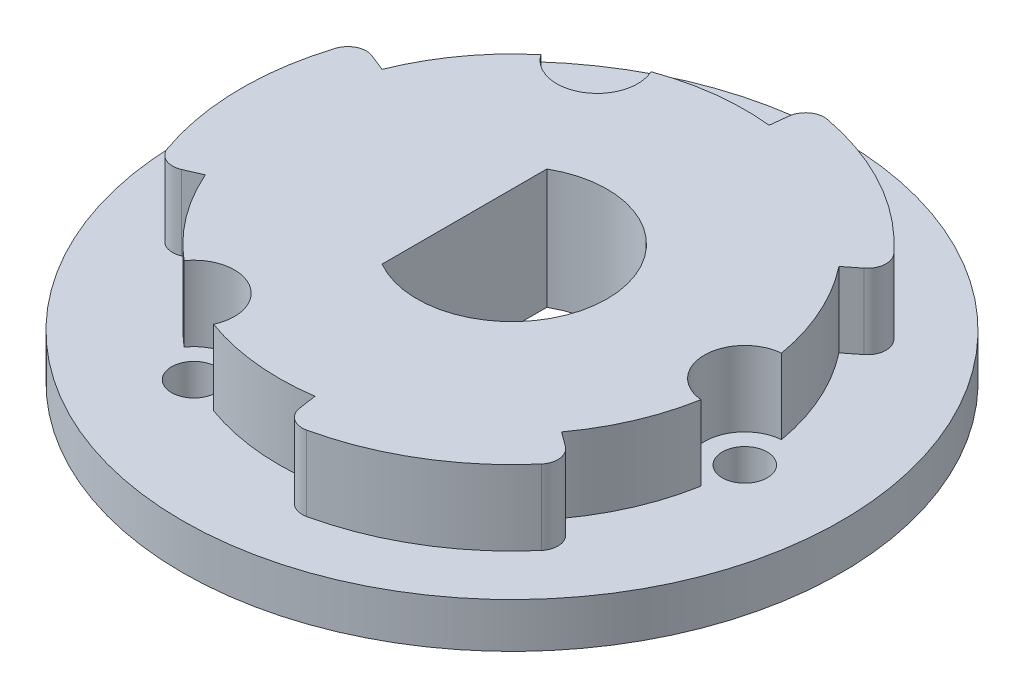
ISO-10303-21;
HEADER;
FILE_DESCRIPTION(('STEP AP214'),'2;1');
FILE_NAME('part.step','',(''),(''),'','','');
FILE_SCHEMA(('AUTOMOTIVE_DESIGN { 1 0 10303 214 1 1 1 1 }'));
ENDSEC;
DATA;
#1=APPLICATION_CONTEXT('core data for automotive mechanical design processes');
#2=APPLICATION_PROTOCOL_DEFINITION('international standard','automotive_design',2000,#1);
#3=PRODUCT_CONTEXT('',#1,'mechanical');
#4=PRODUCT('Part','Part','',(#3));
#5=PRODUCT_RELATED_PRODUCT_CATEGORY('part','',(#4));
#6=PRODUCT_DEFINITION_FORMATION('','',#4);
#7=PRODUCT_DEFINITION_CONTEXT('part definition',#1,'design');
#8=PRODUCT_DEFINITION('design','',#6,#7);
#9=PRODUCT_DEFINITION_SHAPE('','',#8);
#10=(LENGTH_UNIT() NAMED_UNIT(*) SI_UNIT(.MILLI.,.METRE.));
#11=(NAMED_UNIT(*) PLANE_ANGLE_UNIT() SI_UNIT($,.RADIAN.));
#12=(NAMED_UNIT(*) SI_UNIT($,.STERADIAN.) SOLID_ANGLE_UNIT());
#13=UNCERTAINTY_MEASURE_WITH_UNIT(LENGTH_MEASURE(1.E-05),#10,'distance_accuracy_value','');
#14=(GEOMETRIC_REPRESENTATION_CONTEXT(3) GLOBAL_UNCERTAINTY_ASSIGNED_CONTEXT((#13)) GLOBAL_UNIT_ASSIGNED_CONTEXT((#10,
#11,#12)) REPRESENTATION_CONTEXT('',''));
#15=CARTESIAN_POINT('',(0.,0.,0.));
#16=DIRECTION('',(0.,0.,1.));
#17=DIRECTION('',(1.,0.,0.));
#18=AXIS2_PLACEMENT_3D('',#15,#16,#17);
#19=CARTESIAN_POINT('',(0.,-25.,4.97865637605344E-13));
#20=DIRECTION('',(0.,1.,0.));
#21=DIRECTION('',(0.,0.,1.));
#22=AXIS2_PLACEMENT_3D('',#19,#20,#21);
#23=CYLINDRICAL_SURFACE('',#22,15.5400000000005);
#24=CARTESIAN_POINT('',(0.,-20.,4.97865637605344E-13));
#25=DIRECTION('',(0.,-1.,0.));
#26=DIRECTION('',(0.,0.,1.));
#27=AXIS2_PLACEMENT_3D('',#24,#25,#26);
#28=CIRCLE('',#27,15.5400000000005);
#29=CARTESIAN_POINT('',(-5.32329340448422,-20.,-14.5997995647123));
#30=VERTEX_POINT('',#29);
#31=CARTESIAN_POINT('',(1.71604446441181,-20.,-15.44496006457));
#32=VERTEX_POINT('',#31);
#33=EDGE_CURVE('E469',#30,#32,#28,.T.);
#34=ORIENTED_EDGE('',*,*,#33,.T.);
#35=DIRECTION('',(0.,1.,0.));
#36=VECTOR('',#35,1.);
#37=CARTESIAN_POINT('',(1.71604446441181,-25.,-15.44496006457));
#38=LINE('',#37,#36);
#39=CARTESIAN_POINT('',(1.71604446441181,-25.,-15.44496006457));
#40=VERTEX_POINT('',#39);
#41=EDGE_CURVE('E12',#40,#32,#38,.T.);
#42=ORIENTED_EDGE('',*,*,#41,.F.);
#43=CARTESIAN_POINT('',(0.,-25.,4.97865637605344E-13));
#44=DIRECTION('',(0.,-1.,0.));
#45=DIRECTION('',(0.,0.,1.));
#46=AXIS2_PLACEMENT_3D('',#43,#44,#45);
#47=CIRCLE('',#46,15.5400000000005);
#48=CARTESIAN_POINT('',(-5.32329340448422,-25.,-14.5997995647123));
#49=VERTEX_POINT('',#48);
#50=EDGE_CURVE('E473',#49,#40,#47,.T.);
#51=ORIENTED_EDGE('',*,*,#50,.F.);
#52=DIRECTION('',(0.,1.,0.));
#53=VECTOR('',#52,1.);
#54=CARTESIAN_POINT('',(-5.32329340448422,-25.,-14.5997995647123));
#55=LINE('',#54,#53);
#56=EDGE_CURVE('E570',#49,#30,#55,.T.);
#57=ORIENTED_EDGE('',*,*,#56,.T.);
#58=EDGE_LOOP('',(#34,#42,#51,#57));
#59=FACE_BOUND('',#58,.T.);
#60=ADVANCED_FACE('F244',(#59),#23,.T.);
#61=CARTESIAN_POINT('',(1.71604446441181,-25.,-15.44496006457));
#62=DIRECTION('',(0.993884174039252,0.,0.110427571712472));
#63=DIRECTION('',(0.110427571712472,0.,-0.993884174039253));
#64=AXIS2_PLACEMENT_3D('',#61,#62,#63);
#65=PLANE('',#64);
#66=DIRECTION('',(0.110427571712472,0.,-0.993884174039252));
#67=VECTOR('',#66,1.);
#68=CARTESIAN_POINT('',(1.71604446441181,-20.,-15.44496006457));
#69=LINE('',#68,#67);
#70=CARTESIAN_POINT('',(1.84893352009403,-20.,-16.6410049227285));
#71=VERTEX_POINT('',#70);
#72=EDGE_CURVE('E574',#32,#71,#69,.T.);
#73=ORIENTED_EDGE('',*,*,#72,.T.);
#74=DIRECTION('',(0.,1.,0.));
#75=VECTOR('',#74,1.);
#76=CARTESIAN_POINT('',(1.84893352009403,-25.,-16.6410049227285));
#77=LINE('',#76,#75);
#78=CARTESIAN_POINT('',(1.84893352009403,-25.,-16.6410049227285));
#79=VERTEX_POINT('',#78);
#80=EDGE_CURVE('E252',#79,#71,#77,.T.);
#81=ORIENTED_EDGE('',*,*,#80,.F.);
#82=DIRECTION('',(0.110427571712472,0.,-0.993884174039252));
#83=VECTOR('',#82,1.);
#84=CARTESIAN_POINT('',(1.71604446441181,-25.,-15.44496006457));
#85=LINE('',#84,#83);
#86=EDGE_CURVE('E477',#40,#79,#85,.T.);
#87=ORIENTED_EDGE('',*,*,#86,.F.);
#88=ORIENTED_EDGE('',*,*,#41,.T.);
#89=EDGE_LOOP('',(#73,#81,#87,#88));
#90=FACE_BOUND('',#89,.T.);
#91=ADVANCED_FACE('F751',(#90),#65,.F.);
#92=CARTESIAN_POINT('',(3.09128873764314,-25.,-16.5029704580879));
#93=DIRECTION('',(0.,1.,0.));
#94=DIRECTION('',(0.,0.,1.));
#95=AXIS2_PLACEMENT_3D('',#92,#93,#94);
#96=CYLINDRICAL_SURFACE('',#95,1.25000000000005);
#97=CARTESIAN_POINT('',(3.09128873764314,-20.,-16.5029704580879));
#98=DIRECTION('',(0.,-1.,0.));
#99=DIRECTION('',(0.,0.,-1.));
#100=AXIS2_PLACEMENT_3D('',#97,#98,#99);
#101=CIRCLE('',#100,1.25000000000005);
#102=CARTESIAN_POINT('',(3.32143233038018,-20.,-17.7316013736692));
#103=VERTEX_POINT('',#102);
#104=EDGE_CURVE('E577',#71,#103,#101,.T.);
#105=ORIENTED_EDGE('',*,*,#104,.T.);
#106=DIRECTION('',(0.,1.,0.));
#107=VECTOR('',#106,1.);
#108=CARTESIAN_POINT('',(3.32143233038018,-25.,-17.7316013736692));
#109=LINE('',#108,#107);
#110=CARTESIAN_POINT('',(3.32143233038018,-25.,-17.7316013736692));
#111=VERTEX_POINT('',#110);
#112=EDGE_CURVE('E725',#111,#103,#109,.T.);
#113=ORIENTED_EDGE('',*,*,#112,.F.);
#114=CARTESIAN_POINT('',(3.09128873764314,-25.,-16.5029704580879));
#115=DIRECTION('',(0.,-1.,0.));
#116=DIRECTION('',(0.,0.,-1.));
#117=AXIS2_PLACEMENT_3D('',#114,#115,#116);
#118=CIRCLE('',#117,1.25000000000005);
#119=EDGE_CURVE('E482',#79,#111,#118,.T.);
#120=ORIENTED_EDGE('',*,*,#119,.F.);
#121=ORIENTED_EDGE('',*,*,#80,.T.);
#122=EDGE_LOOP('',(#105,#113,#120,#121));
#123=FACE_BOUND('',#122,.T.);
#124=ADVANCED_FACE('F733',(#123),#96,.T.);
#125=CARTESIAN_POINT('',(0.,-25.,0.));
#126=DIRECTION('',(0.,1.,0.));
#127=DIRECTION('',(0.,0.,1.));
#128=AXIS2_PLACEMENT_3D('',#125,#126,#127);
#129=CYLINDRICAL_SURFACE('',#128,18.0400000000001);
#130=CARTESIAN_POINT('',(0.,-20.,0.));
#131=DIRECTION('',(0.,-1.,0.));
#132=DIRECTION('',(0.,0.,1.));
#133=AXIS2_PLACEMENT_3D('',#130,#131,#132);
#134=CIRCLE('',#133,18.0400000000001);
#135=CARTESIAN_POINT('',(13.2993209736678,-20.,-12.188915523514));
#136=VERTEX_POINT('',#135);
#137=EDGE_CURVE('E580',#103,#136,#134,.T.);
#138=ORIENTED_EDGE('',*,*,#137,.T.);
#139=DIRECTION('',(0.,1.,0.));
#140=VECTOR('',#139,1.);
#141=CARTESIAN_POINT('',(13.2993209736678,-25.,-12.188915523514));
#142=LINE('',#141,#140);
#143=CARTESIAN_POINT('',(13.2993209736678,-25.,-12.188915523514));
#144=VERTEX_POINT('',#143);
#145=EDGE_CURVE('E721',#144,#136,#142,.T.);
#146=ORIENTED_EDGE('',*,*,#145,.F.);
#147=CARTESIAN_POINT('',(0.,-25.,0.));
#148=DIRECTION('',(0.,-1.,0.));
#149=DIRECTION('',(0.,0.,1.));
#150=AXIS2_PLACEMENT_3D('',#147,#148,#149);
#151=CIRCLE('',#150,18.0400000000001);
#152=EDGE_CURVE('E486',#111,#144,#151,.T.);
#153=ORIENTED_EDGE('',*,*,#152,.F.);
#154=ORIENTED_EDGE('',*,*,#112,.T.);
#155=EDGE_LOOP('',(#138,#146,#153,#154));
#156=FACE_BOUND('',#155,.T.);
#157=ADVANCED_FACE('F742',(#156),#129,.T.);
#158=CARTESIAN_POINT('',(12.3778053187476,-25.,-11.344339851832));
#159=DIRECTION('',(0.,1.,0.));
#160=DIRECTION('',(0.,0.,1.));
#161=AXIS2_PLACEMENT_3D('',#158,#159,#160);
#162=CYLINDRICAL_SURFACE('',#161,1.24999966698402);
#163=CARTESIAN_POINT('',(12.3778053187476,-20.,-11.344339851832));
#164=DIRECTION('',(0.,-1.,0.));
#165=DIRECTION('',(0.,0.,1.));
#166=AXIS2_PLACEMENT_3D('',#163,#164,#165);
#167=CIRCLE('',#166,1.24999966698402);
#168=CARTESIAN_POINT('',(13.1514305846403,-20.,-10.3625032486069));
#169=VERTEX_POINT('',#168);
#170=EDGE_CURVE('E583',#136,#169,#167,.T.);
#171=ORIENTED_EDGE('',*,*,#170,.T.);
#172=DIRECTION('',(0.,1.,0.));
#173=VECTOR('',#172,1.);
#174=CARTESIAN_POINT('',(13.1514305846403,-25.,-10.3625032486069));
#175=LINE('',#174,#173);
#176=CARTESIAN_POINT('',(13.1514305846403,-25.,-10.3625032486069));
#177=VERTEX_POINT('',#176);
#178=EDGE_CURVE('E717',#177,#169,#175,.T.);
#179=ORIENTED_EDGE('',*,*,#178,.F.);
#180=CARTESIAN_POINT('',(12.3778053187476,-25.,-11.344339851832));
#181=DIRECTION('',(0.,-1.,0.));
#182=DIRECTION('',(0.,0.,1.));
#183=AXIS2_PLACEMENT_3D('',#180,#181,#182);
#184=CIRCLE('',#183,1.24999966698402);
#185=EDGE_CURVE('E490',#144,#177,#184,.T.);
#186=ORIENTED_EDGE('',*,*,#185,.F.);
#187=ORIENTED_EDGE('',*,*,#145,.T.);
#188=EDGE_LOOP('',(#171,#179,#186,#187));
#189=FACE_BOUND('',#188,.T.);
#190=ADVANCED_FACE('F746',(#189),#162,.T.);
#191=CARTESIAN_POINT('',(12.206193142477,-25.,-9.61771537157075));
#192=DIRECTION('',(-0.618900603061181,0.,-0.785469314187707));
#193=DIRECTION('',(-0.785469314187707,0.,0.618900603061181));
#194=AXIS2_PLACEMENT_3D('',#191,#192,#193);
#195=PLANE('',#194);
#196=DIRECTION('',(-0.785469314187707,0.,0.618900603061181));
#197=VECTOR('',#196,1.);
#198=CARTESIAN_POINT('',(12.206193142477,-20.,-9.61771537157075));
#199=LINE('',#198,#197);
#200=CARTESIAN_POINT('',(12.206193142477,-20.,-9.61771537157075));
#201=VERTEX_POINT('',#200);
#202=EDGE_CURVE('E586',#169,#201,#199,.T.);
#203=ORIENTED_EDGE('',*,*,#202,.T.);
#204=DIRECTION('',(0.,1.,0.));
#205=VECTOR('',#204,1.);
#206=CARTESIAN_POINT('',(12.206193142477,-25.,-9.61771537157075));
#207=LINE('',#206,#205);
#208=CARTESIAN_POINT('',(12.206193142477,-25.,-9.61771537157075));
#209=VERTEX_POINT('',#208);
#210=EDGE_CURVE('E713',#209,#201,#207,.T.);
#211=ORIENTED_EDGE('',*,*,#210,.F.);
#212=DIRECTION('',(-0.785469314187707,0.,0.618900603061181));
#213=VECTOR('',#212,1.);
#214=CARTESIAN_POINT('',(12.206193142477,-25.,-9.61771537157075));
#215=LINE('',#214,#213);
#216=EDGE_CURVE('E494',#177,#209,#215,.T.);
#217=ORIENTED_EDGE('',*,*,#216,.F.);
#218=ORIENTED_EDGE('',*,*,#178,.T.);
#219=EDGE_LOOP('',(#203,#211,#217,#218));
#220=FACE_BOUND('',#219,.T.);
#221=ADVANCED_FACE('F827',(#220),#195,.F.);
#222=CARTESIAN_POINT('',(0.,-25.,0.));
#223=DIRECTION('',(0.,1.,0.));
#224=DIRECTION('',(0.,0.,1.));
#225=AXIS2_PLACEMENT_3D('',#222,#223,#224);
#226=CYLINDRICAL_SURFACE('',#225,15.5399999999999);
#227=CARTESIAN_POINT('',(0.,-20.,0.));
#228=DIRECTION('',(0.,-1.,0.));
#229=DIRECTION('',(0.,0.,1.));
#230=AXIS2_PLACEMENT_3D('',#227,#228,#229);
#231=CIRCLE('',#230,15.5399999999999);
#232=CARTESIAN_POINT('',(15.305444015444,-20.,-2.68979246227454));
#233=VERTEX_POINT('',#232);
#234=EDGE_CURVE('E589',#201,#233,#231,.T.);
#235=ORIENTED_EDGE('',*,*,#234,.T.);
#236=DIRECTION('',(0.,1.,0.));
#237=VECTOR('',#236,1.);
#238=CARTESIAN_POINT('',(15.305444015444,-25.,-2.68979246227454));
#239=LINE('',#238,#237);
#240=CARTESIAN_POINT('',(15.305444015444,-25.,-2.68979246227454));
#241=VERTEX_POINT('',#240);
#242=EDGE_CURVE('E709',#241,#233,#239,.T.);
#243=ORIENTED_EDGE('',*,*,#242,.F.);
#244=CARTESIAN_POINT('',(0.,-25.,0.));
#245=DIRECTION('',(0.,-1.,0.));
#246=DIRECTION('',(0.,0.,1.));
#247=AXIS2_PLACEMENT_3D('',#244,#245,#246);
#248=CIRCLE('',#247,15.5399999999999);
#249=EDGE_CURVE('E498',#209,#241,#248,.T.);
#250=ORIENTED_EDGE('',*,*,#249,.F.);
#251=ORIENTED_EDGE('',*,*,#210,.T.);
#252=EDGE_LOOP('',(#235,#243,#250,#251));
#253=FACE_BOUND('',#252,.T.);
#254=ADVANCED_FACE('F825',(#253),#226,.T.);
#255=CARTESIAN_POINT('',(15.54,-25.,0.));
#256=DIRECTION('',(0.,1.,0.));
#257=DIRECTION('',(0.,0.,1.));
#258=AXIS2_PLACEMENT_3D('',#255,#256,#257);
#259=CYLINDRICAL_SURFACE('',#258,2.7);
#260=CARTESIAN_POINT('',(15.54,-20.,0.));
#261=DIRECTION('',(0.,1.,0.));
#262=DIRECTION('',(0.,0.,1.));
#263=AXIS2_PLACEMENT_3D('',#260,#261,#262);
#264=CIRCLE('',#263,2.7);
#265=CARTESIAN_POINT('',(15.305444015444,-20.,2.68979246227454));
#266=VERTEX_POINT('',#265);
#267=EDGE_CURVE('E592',#233,#266,#264,.T.);
#268=ORIENTED_EDGE('',*,*,#267,.T.);
#269=DIRECTION('',(0.,1.,0.));
#270=VECTOR('',#269,1.);
#271=CARTESIAN_POINT('',(15.305444015444,-25.,2.68979246227454));
#272=LINE('',#271,#270);
#273=CARTESIAN_POINT('',(15.305444015444,-25.,2.68979246227454));
#274=VERTEX_POINT('',#273);
#275=EDGE_CURVE('E705',#274,#266,#272,.T.);
#276=ORIENTED_EDGE('',*,*,#275,.F.);
#277=CARTESIAN_POINT('',(15.54,-25.,0.));
#278=DIRECTION('',(0.,1.,0.));
#279=DIRECTION('',(0.,0.,1.));
#280=AXIS2_PLACEMENT_3D('',#277,#278,#279);
#281=CIRCLE('',#280,2.7);
#282=EDGE_CURVE('E502',#241,#274,#281,.T.);
#283=ORIENTED_EDGE('',*,*,#282,.F.);
#284=ORIENTED_EDGE('',*,*,#242,.T.);
#285=EDGE_LOOP('',(#268,#276,#283,#284));
#286=FACE_BOUND('',#285,.T.);
#287=ADVANCED_FACE('F822',(#286),#259,.F.);
#288=CARTESIAN_POINT('',(-4.30211422042248E-13,-25.,-1.6826817716975E-13));
#289=DIRECTION('',(0.,1.,0.));
#290=DIRECTION('',(0.,0.,1.));
#291=AXIS2_PLACEMENT_3D('',#288,#289,#290);
#292=CYLINDRICAL_SURFACE('',#291,15.5400000000005);
#293=CARTESIAN_POINT('',(-4.30211422042248E-13,-20.,-1.6826817716975E-13));
#294=DIRECTION('',(0.,-1.,0.));
#295=DIRECTION('',(0.,0.,-1.));
#296=AXIS2_PLACEMENT_3D('',#293,#294,#295);
#297=CIRCLE('',#296,15.5400000000005);
#298=CARTESIAN_POINT('',(12.5177055441478,-20.,9.20861813248934));
#299=VERTEX_POINT('',#298);
#300=EDGE_CURVE('E595',#266,#299,#297,.T.);
#301=ORIENTED_EDGE('',*,*,#300,.T.);
#302=DIRECTION('',(0.,1.,0.));
#303=VECTOR('',#302,1.);
#304=CARTESIAN_POINT('',(12.5177055441478,-25.,9.20861813248934));
#305=LINE('',#304,#303);
#306=CARTESIAN_POINT('',(12.5177055441478,-25.,9.20861813248934));
#307=VERTEX_POINT('',#306);
#308=EDGE_CURVE('E701',#307,#299,#305,.T.);
#309=ORIENTED_EDGE('',*,*,#308,.F.);
#310=CARTESIAN_POINT('',(-4.30211422042248E-13,-25.,-1.6826817716975E-13));
#311=DIRECTION('',(0.,-1.,0.));
#312=DIRECTION('',(0.,0.,-1.));
#313=AXIS2_PLACEMENT_3D('',#310,#311,#312);
#314=CIRCLE('',#313,15.5400000000005);
#315=EDGE_CURVE('E506',#274,#307,#314,.T.);
#316=ORIENTED_EDGE('',*,*,#315,.F.);
#317=ORIENTED_EDGE('',*,*,#275,.T.);
#318=EDGE_LOOP('',(#301,#309,#316,#317));
#319=FACE_BOUND('',#318,.T.);
#320=ADVANCED_FACE('F818',(#319),#292,.T.);
#321=CARTESIAN_POINT('',(12.5177055441478,-25.,9.20861813248934));
#322=DIRECTION('',(-0.592575169400854,0.,0.805515157281071));
#323=DIRECTION('',(0.805515157281071,0.,0.592575169400854));
#324=AXIS2_PLACEMENT_3D('',#321,#322,#323);
#325=PLANE('',#324);
#326=DIRECTION('',(0.805515157281071,0.,0.592575169400854));
#327=VECTOR('',#326,1.);
#328=CARTESIAN_POINT('',(12.5177055441478,-20.,9.20861813248934));
#329=LINE('',#328,#327);
#330=CARTESIAN_POINT('',(13.4870662475376,-20.,9.92172585967436));
#331=VERTEX_POINT('',#330);
#332=EDGE_CURVE('E598',#299,#331,#329,.T.);
#333=ORIENTED_EDGE('',*,*,#332,.T.);
#334=DIRECTION('',(0.,1.,0.));
#335=VECTOR('',#334,1.);
#336=CARTESIAN_POINT('',(13.4870662475376,-25.,9.92172585967436));
#337=LINE('',#336,#335);
#338=CARTESIAN_POINT('',(13.4870662475376,-25.,9.92172585967436));
#339=VERTEX_POINT('',#338);
#340=EDGE_CURVE('E697',#339,#331,#337,.T.);
#341=ORIENTED_EDGE('',*,*,#340,.F.);
#342=DIRECTION('',(0.805515157281071,0.,0.592575169400854));
#343=VECTOR('',#342,1.);
#344=CARTESIAN_POINT('',(12.5177055441478,-25.,9.20861813248934));
#345=LINE('',#344,#343);
#346=EDGE_CURVE('E510',#307,#339,#345,.T.);
#347=ORIENTED_EDGE('',*,*,#346,.F.);
#348=ORIENTED_EDGE('',*,*,#308,.T.);
#349=EDGE_LOOP('',(#333,#341,#347,#348));
#350=FACE_BOUND('',#349,.T.);
#351=ADVANCED_FACE('F813',(#350),#325,.F.);
#352=CARTESIAN_POINT('',(12.7463472857866,-25.,10.9286198062757));
#353=DIRECTION('',(0.,1.,0.));
#354=DIRECTION('',(0.,0.,1.));
#355=AXIS2_PLACEMENT_3D('',#352,#353,#354);
#356=CYLINDRICAL_SURFACE('',#355,1.24999999999998);
#357=CARTESIAN_POINT('',(12.7463472857866,-20.,10.9286198062757));
#358=DIRECTION('',(0.,-1.,0.));
#359=DIRECTION('',(0.,0.,-1.));
#360=AXIS2_PLACEMENT_3D('',#357,#358,#359);
#361=CIRCLE('',#360,1.24999999999998);
#362=CARTESIAN_POINT('',(13.6953010741864,-20.,11.7422454618947));
#363=VERTEX_POINT('',#362);
#364=EDGE_CURVE('E601',#331,#363,#361,.T.);
#365=ORIENTED_EDGE('',*,*,#364,.T.);
#366=DIRECTION('',(0.,1.,0.));
#367=VECTOR('',#366,1.);
#368=CARTESIAN_POINT('',(13.6953010741864,-25.,11.7422454618947));
#369=LINE('',#368,#367);
#370=CARTESIAN_POINT('',(13.6953010741864,-25.,11.7422454618947));
#371=VERTEX_POINT('',#370);
#372=EDGE_CURVE('E693',#371,#363,#369,.T.);
#373=ORIENTED_EDGE('',*,*,#372,.F.);
#374=CARTESIAN_POINT('',(12.7463472857866,-25.,10.9286198062757));
#375=DIRECTION('',(0.,-1.,0.));
#376=DIRECTION('',(0.,0.,-1.));
#377=AXIS2_PLACEMENT_3D('',#374,#375,#376);
#378=CIRCLE('',#377,1.24999999999998);
#379=EDGE_CURVE('E514',#339,#371,#378,.T.);
#380=ORIENTED_EDGE('',*,*,#379,.F.);
#381=ORIENTED_EDGE('',*,*,#340,.T.);
#382=EDGE_LOOP('',(#365,#373,#380,#381));
#383=FACE_BOUND('',#382,.T.);
#384=ADVANCED_FACE('F810',(#383),#356,.T.);
#385=CARTESIAN_POINT('',(0.,-25.,0.));
#386=DIRECTION('',(0.,1.,0.));
#387=DIRECTION('',(0.,0.,1.));
#388=AXIS2_PLACEMENT_3D('',#385,#386,#387);
#389=CYLINDRICAL_SURFACE('',#388,18.0399999999999);
#390=CARTESIAN_POINT('',(0.,-20.,0.));
#391=DIRECTION('',(0.,-1.,0.));
#392=DIRECTION('',(0.,0.,1.));
#393=AXIS2_PLACEMENT_3D('',#390,#391,#392);
#394=CIRCLE('',#393,18.0399999999999);
#395=CARTESIAN_POINT('',(3.90625000111168,-20.,17.6120075780364));
#396=VERTEX_POINT('',#395);
#397=EDGE_CURVE('E604',#363,#396,#394,.T.);
#398=ORIENTED_EDGE('',*,*,#397,.T.);
#399=DIRECTION('',(0.,1.,0.));
#400=VECTOR('',#399,1.);
#401=CARTESIAN_POINT('',(3.90625000111168,-25.,17.6120075780364));
#402=LINE('',#401,#400);
#403=CARTESIAN_POINT('',(3.90625000111168,-25.,17.6120075780364));
#404=VERTEX_POINT('',#403);
#405=EDGE_CURVE('E689',#404,#396,#402,.T.);
#406=ORIENTED_EDGE('',*,*,#405,.F.);
#407=CARTESIAN_POINT('',(0.,-25.,0.));
#408=DIRECTION('',(0.,-1.,0.));
#409=DIRECTION('',(0.,0.,1.));
#410=AXIS2_PLACEMENT_3D('',#407,#408,#409);
#411=CIRCLE('',#410,18.0399999999999);
#412=EDGE_CURVE('E518',#371,#404,#411,.T.);
#413=ORIENTED_EDGE('',*,*,#412,.F.);
#414=ORIENTED_EDGE('',*,*,#372,.T.);
#415=EDGE_LOOP('',(#398,#406,#413,#414));
#416=FACE_BOUND('',#415,.T.);
#417=ADVANCED_FACE('F806',(#416),#389,.T.);
#418=CARTESIAN_POINT('',(3.63558384147679,-25.,16.3916637750494));
#419=DIRECTION('',(0.,1.,0.));
#420=DIRECTION('',(0.,0.,1.));
#421=AXIS2_PLACEMENT_3D('',#418,#419,#420);
#422=CYLINDRICAL_SURFACE('',#421,1.24999966698402);
#423=CARTESIAN_POINT('',(3.63558384147679,-20.,16.3916637750494));
#424=DIRECTION('',(0.,-1.,0.));
#425=DIRECTION('',(0.,0.,1.));
#426=AXIS2_PLACEMENT_3D('',#423,#424,#425);
#427=CIRCLE('',#426,1.24999966698402);
#428=CARTESIAN_POINT('',(2.3984757677721,-20.,16.5707246067096));
#429=VERTEX_POINT('',#428);
#430=EDGE_CURVE('E607',#396,#429,#427,.T.);
#431=ORIENTED_EDGE('',*,*,#430,.T.);
#432=DIRECTION('',(0.,1.,0.));
#433=VECTOR('',#432,1.);
#434=CARTESIAN_POINT('',(2.3984757677721,-25.,16.5707246067096));
#435=LINE('',#434,#433);
#436=CARTESIAN_POINT('',(2.3984757677721,-25.,16.5707246067096));
#437=VERTEX_POINT('',#436);
#438=EDGE_CURVE('E685',#437,#429,#435,.T.);
#439=ORIENTED_EDGE('',*,*,#438,.F.);
#440=CARTESIAN_POINT('',(3.63558384147679,-25.,16.3916637750494));
#441=DIRECTION('',(0.,-1.,0.));
#442=DIRECTION('',(0.,0.,1.));
#443=AXIS2_PLACEMENT_3D('',#440,#441,#442);
#444=CIRCLE('',#443,1.24999966698402);
#445=EDGE_CURVE('E522',#404,#437,#444,.T.);
#446=ORIENTED_EDGE('',*,*,#445,.F.);
#447=ORIENTED_EDGE('',*,*,#405,.T.);
#448=EDGE_LOOP('',(#431,#439,#446,#447));
#449=FACE_BOUND('',#448,.T.);
#450=ADVANCED_FACE('F801',(#449),#422,.T.);
#451=CARTESIAN_POINT('',(2.2260892669098,-25.,15.3797310306698));
#452=DIRECTION('',(0.989686681510286,0.,-0.143248987574635));
#453=DIRECTION('',(-0.143248987574635,0.,-0.989686681510286));
#454=AXIS2_PLACEMENT_3D('',#451,#452,#453);
#455=PLANE('',#454);
#456=DIRECTION('',(-0.143248987574635,0.,-0.989686681510286));
#457=VECTOR('',#456,1.);
#458=CARTESIAN_POINT('',(2.2260892669098,-20.,15.3797310306698));
#459=LINE('',#458,#457);
#460=CARTESIAN_POINT('',(2.2260892669098,-20.,15.3797310306698));
#461=VERTEX_POINT('',#460);
#462=EDGE_CURVE('E610',#429,#461,#459,.T.);
#463=ORIENTED_EDGE('',*,*,#462,.T.);
#464=DIRECTION('',(0.,1.,0.));
#465=VECTOR('',#464,1.);
#466=CARTESIAN_POINT('',(2.2260892669098,-25.,15.3797310306698));
#467=LINE('',#466,#465);
#468=CARTESIAN_POINT('',(2.2260892669098,-25.,15.3797310306698));
#469=VERTEX_POINT('',#468);
#470=EDGE_CURVE('E681',#469,#461,#467,.T.);
#471=ORIENTED_EDGE('',*,*,#470,.F.);
#472=DIRECTION('',(-0.143248987574635,0.,-0.989686681510286));
#473=VECTOR('',#472,1.);
#474=CARTESIAN_POINT('',(2.2260892669098,-25.,15.3797310306698));
#475=LINE('',#474,#473);
#476=EDGE_CURVE('E526',#437,#469,#475,.T.);
#477=ORIENTED_EDGE('',*,*,#476,.F.);
#478=ORIENTED_EDGE('',*,*,#438,.T.);
#479=EDGE_LOOP('',(#463,#471,#477,#478));
#480=FACE_BOUND('',#479,.T.);
#481=ADVANCED_FACE('F798',(#480),#455,.F.);
#482=CARTESIAN_POINT('',(0.,-25.,-5.7072402359637E-13));
#483=DIRECTION('',(0.,1.,0.));
#484=DIRECTION('',(0.,0.,1.));
#485=AXIS2_PLACEMENT_3D('',#482,#483,#484);
#486=CYLINDRICAL_SURFACE('',#485,15.5400000000006);
#487=CARTESIAN_POINT('',(0.,-20.,-5.7072402359637E-13));
#488=DIRECTION('',(0.,-1.,0.));
#489=DIRECTION('',(0.,0.,-1.));
#490=AXIS2_PLACEMENT_3D('',#487,#488,#489);
#491=CIRCLE('',#490,15.5400000000006);
#492=CARTESIAN_POINT('',(-5.32329340448443,-20.,14.5997995647123));
#493=VERTEX_POINT('',#492);
#494=EDGE_CURVE('E613',#461,#493,#491,.T.);
#495=ORIENTED_EDGE('',*,*,#494,.T.);
#496=DIRECTION('',(0.,1.,0.));
#497=VECTOR('',#496,1.);
#498=CARTESIAN_POINT('',(-5.32329340448443,-25.,14.5997995647123));
#499=LINE('',#498,#497);
#500=CARTESIAN_POINT('',(-5.32329340448443,-25.,14.5997995647123));
#501=VERTEX_POINT('',#500);
#502=EDGE_CURVE('E677',#501,#493,#499,.T.);
#503=ORIENTED_EDGE('',*,*,#502,.F.);
#504=CARTESIAN_POINT('',(0.,-25.,-5.7072402359637E-13));
#505=DIRECTION('',(0.,-1.,0.));
#506=DIRECTION('',(0.,0.,-1.));
#507=AXIS2_PLACEMENT_3D('',#504,#505,#506);
#508=CIRCLE('',#507,15.5400000000006);
#509=EDGE_CURVE('E530',#469,#501,#508,.T.);
#510=ORIENTED_EDGE('',*,*,#509,.F.);
#511=ORIENTED_EDGE('',*,*,#470,.T.);
#512=EDGE_LOOP('',(#495,#503,#510,#511));
#513=FACE_BOUND('',#512,.T.);
#514=ADVANCED_FACE('F794',(#513),#486,.T.);
#515=CARTESIAN_POINT('',(-7.77000000000007,-25.,13.4580347748101));
#516=DIRECTION('',(0.,1.,0.));
#517=DIRECTION('',(0.,0.,1.));
#518=AXIS2_PLACEMENT_3D('',#515,#516,#517);
#519=CYLINDRICAL_SURFACE('',#518,2.7);
#520=CARTESIAN_POINT('',(-7.77000000000007,-20.,13.4580347748101));
#521=DIRECTION('',(0.,1.,0.));
#522=DIRECTION('',(0.,0.,-1.));
#523=AXIS2_PLACEMENT_3D('',#520,#521,#522);
#524=CIRCLE('',#523,2.7);
#525=CARTESIAN_POINT('',(-9.98215061095972,-20.,11.9100071024377));
#526=VERTEX_POINT('',#525);
#527=EDGE_CURVE('E616',#493,#526,#524,.T.);
#528=ORIENTED_EDGE('',*,*,#527,.T.);
#529=DIRECTION('',(0.,1.,0.));
#530=VECTOR('',#529,1.);
#531=CARTESIAN_POINT('',(-9.98215061095972,-25.,11.9100071024377));
#532=LINE('',#531,#530);
#533=CARTESIAN_POINT('',(-9.98215061095972,-25.,11.9100071024377));
#534=VERTEX_POINT('',#533);
#535=EDGE_CURVE('E673',#534,#526,#532,.T.);
#536=ORIENTED_EDGE('',*,*,#535,.F.);
#537=CARTESIAN_POINT('',(-7.77000000000007,-25.,13.4580347748101));
#538=DIRECTION('',(0.,1.,0.));
#539=DIRECTION('',(0.,0.,-1.));
#540=AXIS2_PLACEMENT_3D('',#537,#538,#539);
#541=CIRCLE('',#540,2.7);
#542=EDGE_CURVE('E534',#501,#534,#541,.T.);
#543=ORIENTED_EDGE('',*,*,#542,.F.);
#544=ORIENTED_EDGE('',*,*,#502,.T.);
#545=EDGE_LOOP('',(#528,#536,#543,#544));
#546=FACE_BOUND('',#545,.T.);
#547=ADVANCED_FACE('F789',(#546),#519,.F.);
#548=CARTESIAN_POINT('',(1.43982048506075E-13,-25.,-1.09287578986539E-13));
#549=DIRECTION('',(0.,1.,0.));
#550=DIRECTION('',(0.,0.,1.));
#551=AXIS2_PLACEMENT_3D('',#548,#549,#550);
#552=CYLINDRICAL_SURFACE('',#551,15.5400000000002);
#553=CARTESIAN_POINT('',(1.43982048506075E-13,-20.,-1.09287578986539E-13));
#554=DIRECTION('',(0.,-1.,0.));
#555=DIRECTION('',(0.,0.,1.));
#556=AXIS2_PLACEMENT_3D('',#553,#554,#555);
#557=CIRCLE('',#556,15.5400000000002);
#558=CARTESIAN_POINT('',(-14.2337500085597,-20.,6.23634193208057));
#559=VERTEX_POINT('',#558);
#560=EDGE_CURVE('E619',#526,#559,#557,.T.);
#561=ORIENTED_EDGE('',*,*,#560,.T.);
#562=DIRECTION('',(0.,1.,0.));
#563=VECTOR('',#562,1.);
#564=CARTESIAN_POINT('',(-14.2337500085597,-25.,6.23634193208057));
#565=LINE('',#564,#563);
#566=CARTESIAN_POINT('',(-14.2337500085597,-25.,6.23634193208057));
#567=VERTEX_POINT('',#566);
#568=EDGE_CURVE('E669',#567,#559,#565,.T.);
#569=ORIENTED_EDGE('',*,*,#568,.F.);
#570=CARTESIAN_POINT('',(1.43982048506075E-13,-25.,-1.09287578986539E-13));
#571=DIRECTION('',(0.,-1.,0.));
#572=DIRECTION('',(0.,0.,1.));
#573=AXIS2_PLACEMENT_3D('',#570,#571,#572);
#574=CIRCLE('',#573,15.5400000000002);
#575=EDGE_CURVE('E538',#534,#567,#574,.T.);
#576=ORIENTED_EDGE('',*,*,#575,.F.);
#577=ORIENTED_EDGE('',*,*,#535,.T.);
#578=EDGE_LOOP('',(#561,#569,#576,#577));
#579=FACE_BOUND('',#578,.T.);
#580=ADVANCED_FACE('F786',(#579),#552,.T.);
#581=CARTESIAN_POINT('',(-14.2337500085597,-25.,6.23634193208057));
#582=DIRECTION('',(-0.40130900463839,0.,-0.915942728993546));
#583=DIRECTION('',(-0.915942728993546,0.,0.40130900463839));
#584=AXIS2_PLACEMENT_3D('',#581,#582,#583);
#585=PLANE('',#584);
#586=DIRECTION('',(-0.915942728993546,0.,0.40130900463839));
#587=VECTOR('',#586,1.);
#588=CARTESIAN_POINT('',(-14.2337500085597,-20.,6.23634193208057));
#589=LINE('',#588,#587);
#590=CARTESIAN_POINT('',(-15.3359997676318,-20.,6.71927906305403));
#591=VERTEX_POINT('',#590);
#592=EDGE_CURVE('E622',#559,#591,#589,.T.);
#593=ORIENTED_EDGE('',*,*,#592,.T.);
#594=DIRECTION('',(0.,1.,0.));
#595=VECTOR('',#594,1.);
#596=CARTESIAN_POINT('',(-15.3359997676318,-25.,6.71927906305403));
#597=LINE('',#596,#595);
#598=CARTESIAN_POINT('',(-15.3359997676318,-25.,6.71927906305403));
#599=VERTEX_POINT('',#598);
#600=EDGE_CURVE('E665',#599,#591,#597,.T.);
#601=ORIENTED_EDGE('',*,*,#600,.F.);
#602=DIRECTION('',(-0.915942728993546,0.,0.40130900463839));
#603=VECTOR('',#602,1.);
#604=CARTESIAN_POINT('',(-14.2337500085597,-25.,6.23634193208057));
#605=LINE('',#604,#603);
#606=EDGE_CURVE('E542',#567,#599,#605,.T.);
#607=ORIENTED_EDGE('',*,*,#606,.F.);
#608=ORIENTED_EDGE('',*,*,#568,.T.);
#609=EDGE_LOOP('',(#593,#601,#607,#608));
#610=FACE_BOUND('',#609,.T.);
#611=ADVANCED_FACE('F782',(#610),#585,.F.);
#612=CARTESIAN_POINT('',(-15.8376360234298,-25.,5.57435065181209));
#613=DIRECTION('',(0.,1.,0.));
#614=DIRECTION('',(0.,0.,1.));
#615=AXIS2_PLACEMENT_3D('',#612,#613,#614);
#616=CYLINDRICAL_SURFACE('',#615,1.25);
#617=CARTESIAN_POINT('',(-15.8376360234298,-20.,5.57435065181209));
#618=DIRECTION('',(0.,-1.,0.));
#619=DIRECTION('',(0.,0.,-1.));
#620=AXIS2_PLACEMENT_3D('',#617,#618,#619);
#621=CIRCLE('',#620,1.25);
#622=CARTESIAN_POINT('',(-17.0167334045667,-20.,5.98935591177428));
#623=VERTEX_POINT('',#622);
#624=EDGE_CURVE('E625',#591,#623,#621,.T.);
#625=ORIENTED_EDGE('',*,*,#624,.T.);
#626=DIRECTION('',(0.,1.,0.));
#627=VECTOR('',#626,1.);
#628=CARTESIAN_POINT('',(-17.0167334045667,-25.,5.98935591177428));
#629=LINE('',#628,#627);
#630=CARTESIAN_POINT('',(-17.0167334045667,-25.,5.98935591177428));
#631=VERTEX_POINT('',#630);
#632=EDGE_CURVE('E661',#631,#623,#629,.T.);
#633=ORIENTED_EDGE('',*,*,#632,.F.);
#634=CARTESIAN_POINT('',(-15.8376360234298,-25.,5.57435065181209));
#635=DIRECTION('',(0.,-1.,0.));
#636=DIRECTION('',(0.,0.,-1.));
#637=AXIS2_PLACEMENT_3D('',#634,#635,#636);
#638=CIRCLE('',#637,1.25);
#639=EDGE_CURVE('E546',#599,#631,#638,.T.);
#640=ORIENTED_EDGE('',*,*,#639,.F.);
#641=ORIENTED_EDGE('',*,*,#600,.T.);
#642=EDGE_LOOP('',(#625,#633,#640,#641));
#643=FACE_BOUND('',#642,.T.);
#644=ADVANCED_FACE('F777',(#643),#616,.T.);
#645=CARTESIAN_POINT('',(0.,-25.,0.));
#646=DIRECTION('',(0.,1.,0.));
#647=DIRECTION('',(0.,0.,1.));
#648=AXIS2_PLACEMENT_3D('',#645,#646,#647);
#649=CYLINDRICAL_SURFACE('',#648,18.04);
#650=CARTESIAN_POINT('',(0.,-20.,0.));
#651=DIRECTION('',(0.,-1.,0.));
#652=DIRECTION('',(0.,0.,1.));
#653=AXIS2_PLACEMENT_3D('',#650,#651,#652);
#654=CIRCLE('',#653,18.04);
#655=CARTESIAN_POINT('',(-17.2055709747795,-20.,-5.42309205452259));
#656=VERTEX_POINT('',#655);
#657=EDGE_CURVE('E628',#623,#656,#654,.T.);
#658=ORIENTED_EDGE('',*,*,#657,.T.);
#659=DIRECTION('',(0.,1.,0.));
#660=VECTOR('',#659,1.);
#661=CARTESIAN_POINT('',(-17.2055709747795,-25.,-5.42309205452259));
#662=LINE('',#661,#660);
#663=CARTESIAN_POINT('',(-17.2055709747795,-25.,-5.42309205452259));
#664=VERTEX_POINT('',#663);
#665=EDGE_CURVE('E657',#664,#656,#662,.T.);
#666=ORIENTED_EDGE('',*,*,#665,.F.);
#667=CARTESIAN_POINT('',(0.,-25.,0.));
#668=DIRECTION('',(0.,-1.,0.));
#669=DIRECTION('',(0.,0.,1.));
#670=AXIS2_PLACEMENT_3D('',#667,#668,#669);
#671=CIRCLE('',#670,18.04);
#672=EDGE_CURVE('E550',#631,#664,#671,.T.);
#673=ORIENTED_EDGE('',*,*,#672,.F.);
#674=ORIENTED_EDGE('',*,*,#632,.T.);
#675=EDGE_LOOP('',(#658,#666,#673,#674));
#676=FACE_BOUND('',#675,.T.);
#677=ADVANCED_FACE('F774',(#676),#649,.T.);
#678=CARTESIAN_POINT('',(-16.0133891602244,-25.,-5.04732392321771));
#679=DIRECTION('',(0.,1.,0.));
#680=DIRECTION('',(0.,0.,1.));
#681=AXIS2_PLACEMENT_3D('',#678,#679,#680);
#682=CYLINDRICAL_SURFACE('',#681,1.24999966698402);
#683=CARTESIAN_POINT('',(-16.0133891602244,-20.,-5.04732392321771));
#684=DIRECTION('',(0.,-1.,0.));
#685=DIRECTION('',(0.,0.,1.));
#686=AXIS2_PLACEMENT_3D('',#683,#684,#685);
#687=CIRCLE('',#686,1.24999966698402);
#688=CARTESIAN_POINT('',(-15.5499063524124,-20.,-6.20822135810283));
#689=VERTEX_POINT('',#688);
#690=EDGE_CURVE('E631',#656,#689,#687,.T.);
#691=ORIENTED_EDGE('',*,*,#690,.T.);
#692=DIRECTION('',(0.,1.,0.));
#693=VECTOR('',#692,1.);
#694=CARTESIAN_POINT('',(-15.5499063524124,-25.,-6.20822135810283));
#695=LINE('',#694,#693);
#696=CARTESIAN_POINT('',(-15.5499063524124,-25.,-6.20822135810283));
#697=VERTEX_POINT('',#696);
#698=EDGE_CURVE('E653',#697,#689,#695,.T.);
#699=ORIENTED_EDGE('',*,*,#698,.F.);
#700=CARTESIAN_POINT('',(-16.0133891602244,-25.,-5.04732392321771));
#701=DIRECTION('',(0.,-1.,0.));
#702=DIRECTION('',(0.,0.,1.));
#703=AXIS2_PLACEMENT_3D('',#700,#701,#702);
#704=CIRCLE('',#703,1.24999966698402);
#705=EDGE_CURVE('E554',#664,#697,#704,.T.);
#706=ORIENTED_EDGE('',*,*,#705,.F.);
#707=ORIENTED_EDGE('',*,*,#665,.T.);
#708=EDGE_LOOP('',(#691,#699,#706,#707));
#709=FACE_BOUND('',#708,.T.);
#710=ADVANCED_FACE('F770',(#709),#682,.T.);
#711=CARTESIAN_POINT('',(-14.4322824093868,-25.,-5.76201565909923));
#712=DIRECTION('',(-0.370786078449111,0.,0.928718301762343));
#713=DIRECTION('',(0.928718301762343,0.,0.370786078449111));
#714=AXIS2_PLACEMENT_3D('',#711,#712,#713);
#715=PLANE('',#714);
#716=DIRECTION('',(0.928718301762343,0.,0.370786078449111));
#717=VECTOR('',#716,1.);
#718=CARTESIAN_POINT('',(-14.4322824093868,-20.,-5.76201565909923));
#719=LINE('',#718,#717);
#720=CARTESIAN_POINT('',(-14.4322824093868,-20.,-5.76201565909923));
#721=VERTEX_POINT('',#720);
#722=EDGE_CURVE('E634',#689,#721,#719,.T.);
#723=ORIENTED_EDGE('',*,*,#722,.T.);
#724=DIRECTION('',(0.,1.,0.));
#725=VECTOR('',#724,1.);
#726=CARTESIAN_POINT('',(-14.4322824093868,-25.,-5.76201565909923));
#727=LINE('',#726,#725);
#728=CARTESIAN_POINT('',(-14.4322824093868,-25.,-5.76201565909923));
#729=VERTEX_POINT('',#728);
#730=EDGE_CURVE('E649',#729,#721,#727,.T.);
#731=ORIENTED_EDGE('',*,*,#730,.F.);
#732=DIRECTION('',(0.928718301762343,0.,0.370786078449111));
#733=VECTOR('',#732,1.);
#734=CARTESIAN_POINT('',(-14.4322824093868,-25.,-5.76201565909923));
#735=LINE('',#734,#733);
#736=EDGE_CURVE('E558',#697,#729,#735,.T.);
#737=ORIENTED_EDGE('',*,*,#736,.F.);
#738=ORIENTED_EDGE('',*,*,#698,.T.);
#739=EDGE_LOOP('',(#723,#731,#737,#738));
#740=FACE_BOUND('',#739,.T.);
#741=ADVANCED_FACE('F765',(#740),#715,.F.);
#742=CARTESIAN_POINT('',(2.13370987545147E-13,-25.,1.52655665885959E-13));
#743=DIRECTION('',(0.,1.,0.));
#744=DIRECTION('',(0.,0.,1.));
#745=AXIS2_PLACEMENT_3D('',#742,#743,#744);
#746=CYLINDRICAL_SURFACE('',#745,15.5400000000003);
#747=CARTESIAN_POINT('',(2.13370987545147E-13,-20.,1.52655665885959E-13));
#748=DIRECTION('',(0.,-1.,0.));
#749=DIRECTION('',(0.,0.,1.));
#750=AXIS2_PLACEMENT_3D('',#747,#748,#749);
#751=CIRCLE('',#750,15.5400000000003);
#752=CARTESIAN_POINT('',(-9.98215061095955,-20.,-11.9100071024378));
#753=VERTEX_POINT('',#752);
#754=EDGE_CURVE('E637',#721,#753,#751,.T.);
#755=ORIENTED_EDGE('',*,*,#754,.T.);
#756=DIRECTION('',(0.,1.,0.));
#757=VECTOR('',#756,1.);
#758=CARTESIAN_POINT('',(-9.98215061095955,-25.,-11.9100071024378));
#759=LINE('',#758,#757);
#760=CARTESIAN_POINT('',(-9.98215061095955,-25.,-11.9100071024378));
#761=VERTEX_POINT('',#760);
#762=EDGE_CURVE('E645',#761,#753,#759,.T.);
#763=ORIENTED_EDGE('',*,*,#762,.F.);
#764=CARTESIAN_POINT('',(2.13370987545147E-13,-25.,1.52655665885959E-13));
#765=DIRECTION('',(0.,-1.,0.));
#766=DIRECTION('',(0.,0.,1.));
#767=AXIS2_PLACEMENT_3D('',#764,#765,#766);
#768=CIRCLE('',#767,15.5400000000003);
#769=EDGE_CURVE('E562',#729,#761,#768,.T.);
#770=ORIENTED_EDGE('',*,*,#769,.F.);
#771=ORIENTED_EDGE('',*,*,#730,.T.);
#772=EDGE_LOOP('',(#755,#763,#770,#771));
#773=FACE_BOUND('',#772,.T.);
#774=ADVANCED_FACE('F762',(#773),#746,.T.);
#775=CARTESIAN_POINT('',(-7.76999999999988,-25.,-13.4580347748102));
#776=DIRECTION('',(0.,1.,0.));
#777=DIRECTION('',(0.,0.,1.));
#778=AXIS2_PLACEMENT_3D('',#775,#776,#777);
#779=CYLINDRICAL_SURFACE('',#778,2.7);
#780=CARTESIAN_POINT('',(-7.76999999999988,-20.,-13.4580347748102));
#781=DIRECTION('',(0.,1.,0.));
#782=DIRECTION('',(0.,0.,-1.));
#783=AXIS2_PLACEMENT_3D('',#780,#781,#782);
#784=CIRCLE('',#783,2.7);
#785=EDGE_CURVE('E478',#753,#30,#784,.T.);
#786=ORIENTED_EDGE('',*,*,#785,.T.);
#787=ORIENTED_EDGE('',*,*,#56,.F.);
#788=CARTESIAN_POINT('',(-7.76999999999988,-25.,-13.4580347748102));
#789=DIRECTION('',(0.,1.,0.));
#790=DIRECTION('',(0.,0.,-1.));
#791=AXIS2_PLACEMENT_3D('',#788,#789,#790);
#792=CIRCLE('',#791,2.7);
#793=EDGE_CURVE('E566',#761,#49,#792,.T.);
#794=ORIENTED_EDGE('',*,*,#793,.F.);
#795=ORIENTED_EDGE('',*,*,#762,.T.);
#796=EDGE_LOOP('',(#786,#787,#794,#795));
#797=FACE_BOUND('',#796,.T.);
#798=ADVANCED_FACE('F758',(#797),#779,.F.);
#799=CARTESIAN_POINT('',(0.,-20.,4.97865637605344E-13));
#800=DIRECTION('',(0.,1.,0.));
#801=DIRECTION('',(0.,0.,1.));
#802=AXIS2_PLACEMENT_3D('',#799,#800,#801);
#803=PLANE('',#802);
#804=DIRECTION('',(0.,0.,1.));
#805=VECTOR('',#804,1.);
#806=CARTESIAN_POINT('',(-3.175,-20.,4.97865637605344E-13));
#807=LINE('',#806,#805);
#808=CARTESIAN_POINT('',(-3.175,-20.,-5.49926131403118));
#809=VERTEX_POINT('',#808);
#810=CARTESIAN_POINT('',(-3.175,-20.,5.49926131403119));
#811=VERTEX_POINT('',#810);
#812=EDGE_CURVE('E417',#809,#811,#807,.T.);
#813=ORIENTED_EDGE('',*,*,#812,.F.);
#814=CARTESIAN_POINT('',(0.,-20.,0.));
#815=DIRECTION('',(0.,1.,0.));
#816=DIRECTION('',(0.,0.,1.));
#817=AXIS2_PLACEMENT_3D('',#814,#815,#816);
#818=CIRCLE('',#817,6.35);
#819=EDGE_CURVE('E420',#811,#809,#818,.T.);
#820=ORIENTED_EDGE('',*,*,#819,.F.);
#821=EDGE_LOOP('',(#813,#820));
#822=FACE_BOUND('',#821,.T.);
#823=ORIENTED_EDGE('',*,*,#33,.F.);
#824=ORIENTED_EDGE('',*,*,#785,.F.);
#825=ORIENTED_EDGE('',*,*,#754,.F.);
#826=ORIENTED_EDGE('',*,*,#722,.F.);
#827=ORIENTED_EDGE('',*,*,#690,.F.);
#828=ORIENTED_EDGE('',*,*,#657,.F.);
#829=ORIENTED_EDGE('',*,*,#624,.F.);
#830=ORIENTED_EDGE('',*,*,#592,.F.);
#831=ORIENTED_EDGE('',*,*,#560,.F.);
#832=ORIENTED_EDGE('',*,*,#527,.F.);
#833=ORIENTED_EDGE('',*,*,#494,.F.);
#834=ORIENTED_EDGE('',*,*,#462,.F.);
#835=ORIENTED_EDGE('',*,*,#430,.F.);
#836=ORIENTED_EDGE('',*,*,#397,.F.);
#837=ORIENTED_EDGE('',*,*,#364,.F.);
#838=ORIENTED_EDGE('',*,*,#332,.F.);
#839=ORIENTED_EDGE('',*,*,#300,.F.);
#840=ORIENTED_EDGE('',*,*,#267,.F.);
#841=ORIENTED_EDGE('',*,*,#234,.F.);
#842=ORIENTED_EDGE('',*,*,#202,.F.);
#843=ORIENTED_EDGE('',*,*,#170,.F.);
#844=ORIENTED_EDGE('',*,*,#137,.F.);
#845=ORIENTED_EDGE('',*,*,#104,.F.);
#846=ORIENTED_EDGE('',*,*,#72,.F.);
#847=EDGE_LOOP('',(#823,#824,#825,#826,#827,#828,#829,#830,#831,#832,#833,#834,#835,#836,#837,
#838,#839,#840,#841,#842,#843,#844,#845,#846));
#848=FACE_BOUND('',#847,.T.);
#849=ADVANCED_FACE('F738',(#822,#848),#803,.T.);
#850=CARTESIAN_POINT('',(0.,-25.,0.));
#851=DIRECTION('',(0.,-1.,0.));
#852=DIRECTION('',(0.,0.,-1.));
#853=AXIS2_PLACEMENT_3D('',#850,#851,#852);
#854=PLANE('',#853);
#855=CARTESIAN_POINT('',(-7.76999999999988,-25.,-13.4580347748102));
#856=DIRECTION('',(0.,1.,0.));
#857=DIRECTION('',(0.,0.,1.));
#858=AXIS2_PLACEMENT_3D('',#855,#856,#857);
#859=CIRCLE('',#858,1.5);
#860=CARTESIAN_POINT('',(-7.76999999999988,-25.,-11.9580347748102));
#861=VERTEX_POINT('',#860);
#862=EDGE_CURVE('E446',#861,#861,#859,.T.);
#863=ORIENTED_EDGE('',*,*,#862,.F.);
#864=EDGE_LOOP('',(#863));
#865=FACE_BOUND('',#864,.T.);
#866=CARTESIAN_POINT('',(15.54,-25.,0.));
#867=DIRECTION('',(0.,1.,0.));
#868=DIRECTION('',(0.,0.,1.));
#869=AXIS2_PLACEMENT_3D('',#866,#867,#868);
#870=CIRCLE('',#869,1.5);
#871=CARTESIAN_POINT('',(15.54,-25.,1.5));
#872=VERTEX_POINT('',#871);
#873=EDGE_CURVE('E450',#872,#872,#870,.T.);
#874=ORIENTED_EDGE('',*,*,#873,.F.);
#875=EDGE_LOOP('',(#874));
#876=FACE_BOUND('',#875,.T.);
#877=CARTESIAN_POINT('',(-7.77000000000006,-25.,13.4580347748101));
#878=DIRECTION('',(0.,1.,0.));
#879=DIRECTION('',(0.,0.,1.));
#880=AXIS2_PLACEMENT_3D('',#877,#878,#879);
#881=CIRCLE('',#880,1.5);
#882=CARTESIAN_POINT('',(-7.77000000000006,-25.,14.9580347748101));
#883=VERTEX_POINT('',#882);
#884=EDGE_CURVE('E458',#883,#883,#881,.T.);
#885=ORIENTED_EDGE('',*,*,#884,.F.);
#886=EDGE_LOOP('',(#885));
#887=FACE_BOUND('',#886,.T.);
#888=CARTESIAN_POINT('',(0.,-25.,0.));
#889=DIRECTION('',(0.,-1.,0.));
#890=DIRECTION('',(0.,0.,-1.));
#891=AXIS2_PLACEMENT_3D('',#888,#889,#890);
#892=CIRCLE('',#891,22.);
#893=CARTESIAN_POINT('',(0.,-25.,-22.));
#894=VERTEX_POINT('',#893);
#895=EDGE_CURVE('E445',#894,#894,#892,.T.);
#896=ORIENTED_EDGE('',*,*,#895,.F.);
#897=EDGE_LOOP('',(#896));
#898=FACE_BOUND('',#897,.T.);
#899=ORIENTED_EDGE('',*,*,#793,.T.);
#900=ORIENTED_EDGE('',*,*,#50,.T.);
#901=ORIENTED_EDGE('',*,*,#86,.T.);
#902=ORIENTED_EDGE('',*,*,#119,.T.);
#903=ORIENTED_EDGE('',*,*,#152,.T.);
#904=ORIENTED_EDGE('',*,*,#185,.T.);
#905=ORIENTED_EDGE('',*,*,#216,.T.);
#906=ORIENTED_EDGE('',*,*,#249,.T.);
#907=ORIENTED_EDGE('',*,*,#282,.T.);
#908=ORIENTED_EDGE('',*,*,#315,.T.);
#909=ORIENTED_EDGE('',*,*,#346,.T.);
#910=ORIENTED_EDGE('',*,*,#379,.T.);
#911=ORIENTED_EDGE('',*,*,#412,.T.);
#912=ORIENTED_EDGE('',*,*,#445,.T.);
#913=ORIENTED_EDGE('',*,*,#476,.T.);
#914=ORIENTED_EDGE('',*,*,#509,.T.);
#915=ORIENTED_EDGE('',*,*,#542,.T.);
#916=ORIENTED_EDGE('',*,*,#575,.T.);
#917=ORIENTED_EDGE('',*,*,#606,.T.);
#918=ORIENTED_EDGE('',*,*,#639,.T.);
#919=ORIENTED_EDGE('',*,*,#672,.T.);
#920=ORIENTED_EDGE('',*,*,#705,.T.);
#921=ORIENTED_EDGE('',*,*,#736,.T.);
#922=ORIENTED_EDGE('',*,*,#769,.T.);
#923=EDGE_LOOP('',(#899,#900,#901,#902,#903,#904,#905,#906,#907,#908,#909,#910,#911,#912,#913,
#914,#915,#916,#917,#918,#919,#920,#921,#922));
#924=FACE_BOUND('',#923,.T.);
#925=ADVANCED_FACE('F749',(#865,#876,#887,#898,#924),#854,.F.);
#926=CARTESIAN_POINT('',(0.,-28.,0.));
#927=DIRECTION('',(0.,1.,0.));
#928=DIRECTION('',(0.,0.,1.));
#929=AXIS2_PLACEMENT_3D('',#926,#927,#928);
#930=CYLINDRICAL_SURFACE('',#929,22.);
#931=CARTESIAN_POINT('',(0.,-28.,0.));
#932=DIRECTION('',(0.,-1.,0.));
#933=DIRECTION('',(0.,0.,-1.));
#934=AXIS2_PLACEMENT_3D('',#931,#932,#933);
#935=CIRCLE('',#934,22.);
#936=CARTESIAN_POINT('',(0.,-28.,-22.));
#937=VERTEX_POINT('',#936);
#938=EDGE_CURVE('E465',#937,#937,#935,.T.);
#939=ORIENTED_EDGE('',*,*,#938,.F.);
#940=EDGE_LOOP('',(#939));
#941=FACE_BOUND('',#940,.T.);
#942=ORIENTED_EDGE('',*,*,#895,.T.);
#943=EDGE_LOOP('',(#942));
#944=FACE_BOUND('',#943,.T.);
#945=ADVANCED_FACE('F1023',(#941,#944),#930,.T.);
#946=CARTESIAN_POINT('',(0.,-28.,0.));
#947=DIRECTION('',(0.,-1.,0.));
#948=DIRECTION('',(0.,0.,-1.));
#949=AXIS2_PLACEMENT_3D('',#946,#947,#948);
#950=PLANE('',#949);
#951=DIRECTION('',(0.,0.,-1.));
#952=VECTOR('',#951,1.);
#953=CARTESIAN_POINT('',(-3.175,-28.,0.));
#954=LINE('',#953,#952);
#955=CARTESIAN_POINT('',(-3.175,-28.,5.49926131403118));
#956=VERTEX_POINT('',#955);
#957=CARTESIAN_POINT('',(-3.175,-28.,-5.49926131403119));
#958=VERTEX_POINT('',#957);
#959=EDGE_CURVE('E266',#956,#958,#954,.T.);
#960=ORIENTED_EDGE('',*,*,#959,.F.);
#961=CARTESIAN_POINT('',(0.,-28.,0.));
#962=DIRECTION('',(0.,-1.,0.));
#963=DIRECTION('',(0.,0.,-1.));
#964=AXIS2_PLACEMENT_3D('',#961,#962,#963);
#965=CIRCLE('',#964,6.35);
#966=EDGE_CURVE('E424',#958,#956,#965,.T.);
#967=ORIENTED_EDGE('',*,*,#966,.F.);
#968=EDGE_LOOP('',(#960,#967));
#969=FACE_BOUND('',#968,.T.);
#970=CARTESIAN_POINT('',(-7.76999999999988,-28.,-13.4580347748102));
#971=DIRECTION('',(0.,1.,0.));
#972=DIRECTION('',(0.,0.,1.));
#973=AXIS2_PLACEMENT_3D('',#970,#971,#972);
#974=CIRCLE('',#973,1.5);
#975=CARTESIAN_POINT('',(-7.76999999999988,-28.,-11.9580347748102));
#976=VERTEX_POINT('',#975);
#977=EDGE_CURVE('E441',#976,#976,#974,.T.);
#978=ORIENTED_EDGE('',*,*,#977,.T.);
#979=EDGE_LOOP('',(#978));
#980=FACE_BOUND('',#979,.T.);
#981=CARTESIAN_POINT('',(15.54,-28.,0.));
#982=DIRECTION('',(0.,1.,0.));
#983=DIRECTION('',(0.,0.,1.));
#984=AXIS2_PLACEMENT_3D('',#981,#982,#983);
#985=CIRCLE('',#984,1.5);
#986=CARTESIAN_POINT('',(15.54,-28.,1.5));
#987=VERTEX_POINT('',#986);
#988=EDGE_CURVE('E454',#987,#987,#985,.T.);
#989=ORIENTED_EDGE('',*,*,#988,.T.);
#990=EDGE_LOOP('',(#989));
#991=FACE_BOUND('',#990,.T.);
#992=CARTESIAN_POINT('',(-7.77000000000006,-28.,13.4580347748101));
#993=DIRECTION('',(0.,1.,0.));
#994=DIRECTION('',(0.,0.,1.));
#995=AXIS2_PLACEMENT_3D('',#992,#993,#994);
#996=CIRCLE('',#995,1.5);
#997=CARTESIAN_POINT('',(-7.77000000000006,-28.,14.9580347748101));
#998=VERTEX_POINT('',#997);
#999=EDGE_CURVE('E440',#998,#998,#996,.T.);
#1000=ORIENTED_EDGE('',*,*,#999,.T.);
#1001=EDGE_LOOP('',(#1000));
#1002=FACE_BOUND('',#1001,.T.);
#1003=ORIENTED_EDGE('',*,*,#938,.T.);
#1004=EDGE_LOOP('',(#1003));
#1005=FACE_BOUND('',#1004,.T.);
#1006=ADVANCED_FACE('F429',(#969,#980,#991,#1002,#1005),#950,.T.);
#1007=CARTESIAN_POINT('',(-7.77000000000006,-28.,13.4580347748101));
#1008=DIRECTION('',(0.,1.,0.));
#1009=DIRECTION('',(0.,0.,1.));
#1010=AXIS2_PLACEMENT_3D('',#1007,#1008,#1009);
#1011=CYLINDRICAL_SURFACE('',#1010,1.5);
#1012=ORIENTED_EDGE('',*,*,#999,.F.);
#1013=EDGE_LOOP('',(#1012));
#1014=FACE_BOUND('',#1013,.T.);
#1015=ORIENTED_EDGE('',*,*,#884,.T.);
#1016=EDGE_LOOP('',(#1015));
#1017=FACE_BOUND('',#1016,.T.);
#1018=ADVANCED_FACE('F1041',(#1014,#1017),#1011,.F.);
#1019=CARTESIAN_POINT('',(15.54,-28.,0.));
#1020=DIRECTION('',(0.,1.,0.));
#1021=DIRECTION('',(0.,0.,1.));
#1022=AXIS2_PLACEMENT_3D('',#1019,#1020,#1021);
#1023=CYLINDRICAL_SURFACE('',#1022,1.5);
#1024=ORIENTED_EDGE('',*,*,#988,.F.);
#1025=EDGE_LOOP('',(#1024));
#1026=FACE_BOUND('',#1025,.T.);
#1027=ORIENTED_EDGE('',*,*,#873,.T.);
#1028=EDGE_LOOP('',(#1027));
#1029=FACE_BOUND('',#1028,.T.);
#1030=ADVANCED_FACE('F1050',(#1026,#1029),#1023,.F.);
#1031=CARTESIAN_POINT('',(-7.76999999999988,-28.,-13.4580347748102));
#1032=DIRECTION('',(0.,1.,0.));
#1033=DIRECTION('',(0.,0.,1.));
#1034=AXIS2_PLACEMENT_3D('',#1031,#1032,#1033);
#1035=CYLINDRICAL_SURFACE('',#1034,1.5);
#1036=ORIENTED_EDGE('',*,*,#977,.F.);
#1037=EDGE_LOOP('',(#1036));
#1038=FACE_BOUND('',#1037,.T.);
#1039=ORIENTED_EDGE('',*,*,#862,.T.);
#1040=EDGE_LOOP('',(#1039));
#1041=FACE_BOUND('',#1040,.T.);
#1042=ADVANCED_FACE('F1060',(#1038,#1041),#1035,.F.);
#1043=CARTESIAN_POINT('',(-3.175,-13.,0.));
#1044=DIRECTION('',(-1.,0.,0.));
#1045=DIRECTION('',(0.,0.,1.));
#1046=AXIS2_PLACEMENT_3D('',#1043,#1044,#1045);
#1047=PLANE('',#1046);
#1048=ORIENTED_EDGE('',*,*,#812,.T.);
#1049=DIRECTION('',(0.,-1.,0.));
#1050=VECTOR('',#1049,1.);
#1051=CARTESIAN_POINT('',(-3.175,-13.,5.49926131403118));
#1052=LINE('',#1051,#1050);
#1053=EDGE_CURVE('E259',#811,#956,#1052,.T.);
#1054=ORIENTED_EDGE('',*,*,#1053,.T.);
#1055=ORIENTED_EDGE('',*,*,#959,.T.);
#1056=DIRECTION('',(0.,-1.,0.));
#1057=VECTOR('',#1056,1.);
#1058=CARTESIAN_POINT('',(-3.175,-13.,-5.49926131403118));
#1059=LINE('',#1058,#1057);
#1060=EDGE_CURVE('E421',#809,#958,#1059,.T.);
#1061=ORIENTED_EDGE('',*,*,#1060,.F.);
#1062=EDGE_LOOP('',(#1048,#1054,#1055,#1061));
#1063=FACE_BOUND('',#1062,.T.);
#1064=ADVANCED_FACE('F415',(#1063),#1047,.F.);
#1065=CARTESIAN_POINT('',(0.,-13.,0.));
#1066=DIRECTION('',(0.,-1.,0.));
#1067=DIRECTION('',(0.,0.,-1.));
#1068=AXIS2_PLACEMENT_3D('',#1065,#1066,#1067);
#1069=CYLINDRICAL_SURFACE('',#1068,6.35);
#1070=ORIENTED_EDGE('',*,*,#819,.T.);
#1071=ORIENTED_EDGE('',*,*,#1060,.T.);
#1072=ORIENTED_EDGE('',*,*,#966,.T.);
#1073=ORIENTED_EDGE('',*,*,#1053,.F.);
#1074=EDGE_LOOP('',(#1070,#1071,#1072,#1073));
#1075=FACE_BOUND('',#1074,.T.);
#1076=ADVANCED_FACE('F425',(#1075),#1069,.F.);
#1077=CLOSED_SHELL('',(#60,#91,#124,#157,#190,#221,#254,#287,#320,#351,#384,#417,#450,#481,#514,
#547,#580,#611,#644,#677,#710,#741,#774,#798,#849,#925,#945,#1006,#1018,#1030,#1042,#1064,#1076));
#1078=MANIFOLD_SOLID_BREP('B2',#1077);
#1079=ADVANCED_BREP_SHAPE_REPRESENTATION('',(#18,#1078),#14);
#1080=SHAPE_DEFINITION_REPRESENTATION(#9,#1079);
ENDSEC;
END-ISO-10303-21;
